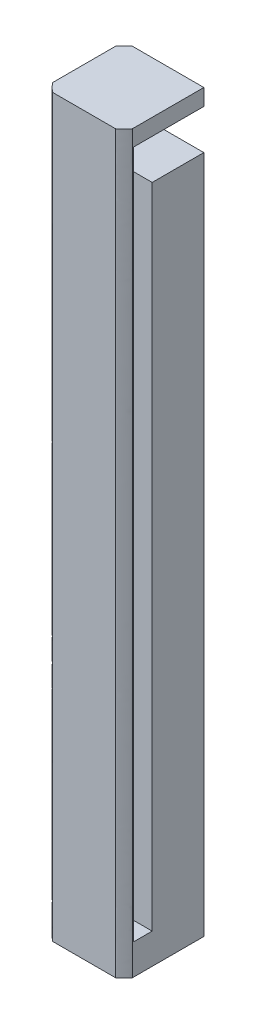
ISO-10303-21;
HEADER;
FILE_DESCRIPTION(('STEP AP214'),'2;1');
FILE_NAME('part.step','',(''),(''),'','','');
FILE_SCHEMA(('AUTOMOTIVE_DESIGN { 1 0 10303 214 1 1 1 1 }'));
ENDSEC;
DATA;
#1=APPLICATION_CONTEXT('core data for automotive mechanical design processes');
#2=APPLICATION_PROTOCOL_DEFINITION('international standard','automotive_design',2000,#1);
#3=PRODUCT_CONTEXT('',#1,'mechanical');
#4=PRODUCT('Part','Part','',(#3));
#5=PRODUCT_RELATED_PRODUCT_CATEGORY('part','',(#4));
#6=PRODUCT_DEFINITION_FORMATION('','',#4);
#7=PRODUCT_DEFINITION_CONTEXT('part definition',#1,'design');
#8=PRODUCT_DEFINITION('design','',#6,#7);
#9=PRODUCT_DEFINITION_SHAPE('','',#8);
#10=(LENGTH_UNIT() NAMED_UNIT(*) SI_UNIT(.MILLI.,.METRE.));
#11=(NAMED_UNIT(*) PLANE_ANGLE_UNIT() SI_UNIT($,.RADIAN.));
#12=(NAMED_UNIT(*) SI_UNIT($,.STERADIAN.) SOLID_ANGLE_UNIT());
#13=UNCERTAINTY_MEASURE_WITH_UNIT(LENGTH_MEASURE(1.E-05),#10,'distance_accuracy_value','');
#14=(GEOMETRIC_REPRESENTATION_CONTEXT(3) GLOBAL_UNCERTAINTY_ASSIGNED_CONTEXT((#13)) GLOBAL_UNIT_ASSIGNED_CONTEXT((#10,
#11,#12)) REPRESENTATION_CONTEXT('',''));
#15=CARTESIAN_POINT('',(0.,0.,0.));
#16=DIRECTION('',(0.,0.,1.));
#17=DIRECTION('',(1.,0.,0.));
#18=AXIS2_PLACEMENT_3D('',#15,#16,#17);
#19=CARTESIAN_POINT('',(0.,75.,-10.));
#20=DIRECTION('',(0.,0.,1.));
#21=DIRECTION('',(1.,0.,0.));
#22=AXIS2_PLACEMENT_3D('',#19,#20,#21);
#23=PLANE('',#22);
#24=DIRECTION('',(1.,0.,0.));
#25=VECTOR('',#24,1.);
#26=CARTESIAN_POINT('',(0.,-3.25,-10.));
#27=LINE('',#26,#25);
#28=CARTESIAN_POINT('',(2.4,-3.25,-10.));
#29=VERTEX_POINT('',#28);
#30=CARTESIAN_POINT('',(10.,-3.25,-10.));
#31=VERTEX_POINT('',#30);
#32=EDGE_CURVE('E253',#29,#31,#27,.T.);
#33=ORIENTED_EDGE('',*,*,#32,.F.);
#34=CARTESIAN_POINT('',(2.4,78.9125,-10.));
#35=CARTESIAN_POINT('',(2.4,50.2208333333334,-10.));
#36=CARTESIAN_POINT('',(2.4,21.5291666666666,-10.));
#37=CARTESIAN_POINT('',(2.4,-7.1625,-10.));
#38=(BOUNDED_CURVE() B_SPLINE_CURVE(3,(#34,#35,#36,#37),.UNSPECIFIED.,.F.,
.F.) B_SPLINE_CURVE_WITH_KNOTS((4,4),(-0.0039125,0.0821625),
.UNSPECIFIED.) CURVE() GEOMETRIC_REPRESENTATION_ITEM() RATIONAL_B_SPLINE_CURVE((1.,1.,1.,1.)) REPRESENTATION_ITEM(''));
#39=CARTESIAN_POINT('',(2.4,75.,-10.));
#40=VERTEX_POINT('',#39);
#41=EDGE_CURVE('E12',#29,#40,#38,.F.);
#42=ORIENTED_EDGE('',*,*,#41,.T.);
#43=DIRECTION('',(-1.,0.,0.));
#44=VECTOR('',#43,1.);
#45=CARTESIAN_POINT('',(0.,75.,-10.));
#46=LINE('',#45,#44);
#47=CARTESIAN_POINT('',(10.,75.,-10.));
#48=VERTEX_POINT('',#47);
#49=EDGE_CURVE('E483',#48,#40,#46,.T.);
#50=ORIENTED_EDGE('',*,*,#49,.F.);
#51=DIRECTION('',(0.,-1.,0.));
#52=VECTOR('',#51,1.);
#53=CARTESIAN_POINT('',(10.,75.,-10.));
#54=LINE('',#53,#52);
#55=CARTESIAN_POINT('',(10.,73.25,-10.));
#56=VERTEX_POINT('',#55);
#57=EDGE_CURVE('E482',#48,#56,#54,.T.);
#58=ORIENTED_EDGE('',*,*,#57,.T.);
#59=DIRECTION('',(1.,0.,0.));
#60=VECTOR('',#59,1.);
#61=CARTESIAN_POINT('',(2.5,73.25,-10.));
#62=LINE('',#61,#60);
#63=CARTESIAN_POINT('',(2.5,73.25,-10.));
#64=VERTEX_POINT('',#63);
#65=EDGE_CURVE('E484',#64,#56,#62,.T.);
#66=ORIENTED_EDGE('',*,*,#65,.F.);
#67=DIRECTION('',(0.,-1.,0.));
#68=VECTOR('',#67,1.);
#69=CARTESIAN_POINT('',(2.5,83.8566017177982,-10.));
#70=LINE('',#69,#68);
#71=CARTESIAN_POINT('',(2.5,0.,-10.));
#72=VERTEX_POINT('',#71);
#73=EDGE_CURVE('E819',#64,#72,#70,.T.);
#74=ORIENTED_EDGE('',*,*,#73,.T.);
#75=DIRECTION('',(1.,0.,0.));
#76=VECTOR('',#75,1.);
#77=CARTESIAN_POINT('',(0.,0.,-10.));
#78=LINE('',#77,#76);
#79=CARTESIAN_POINT('',(4.5,0.,-10.));
#80=VERTEX_POINT('',#79);
#81=EDGE_CURVE('E247',#72,#80,#78,.T.);
#82=ORIENTED_EDGE('',*,*,#81,.T.);
#83=DIRECTION('',(0.,-1.,0.));
#84=VECTOR('',#83,1.);
#85=CARTESIAN_POINT('',(4.5,83.8566017177982,-10.));
#86=LINE('',#85,#84);
#87=CARTESIAN_POINT('',(4.5,69.,-10.));
#88=VERTEX_POINT('',#87);
#89=EDGE_CURVE('E225',#88,#80,#86,.T.);
#90=ORIENTED_EDGE('',*,*,#89,.F.);
#91=DIRECTION('',(-1.,0.,0.));
#92=VECTOR('',#91,1.);
#93=CARTESIAN_POINT('',(2.5,69.,-10.));
#94=LINE('',#93,#92);
#95=CARTESIAN_POINT('',(10.,69.,-10.));
#96=VERTEX_POINT('',#95);
#97=EDGE_CURVE('E241',#96,#88,#94,.T.);
#98=ORIENTED_EDGE('',*,*,#97,.F.);
#99=DIRECTION('',(0.,1.,0.));
#100=VECTOR('',#99,1.);
#101=CARTESIAN_POINT('',(10.,-3.25,-10.));
#102=LINE('',#101,#100);
#103=EDGE_CURVE('E384',#31,#96,#102,.T.);
#104=ORIENTED_EDGE('',*,*,#103,.F.);
#105=EDGE_LOOP('',(#33,#42,#50,#58,#66,#74,#82,#90,#98,#104));
#106=FACE_BOUND('',#105,.T.);
#107=ADVANCED_FACE('F44',(#106),#23,.F.);
#108=CARTESIAN_POINT('',(0.,75.,0.));
#109=DIRECTION('',(0.,-1.,0.));
#110=DIRECTION('',(0.,0.,-1.));
#111=AXIS2_PLACEMENT_3D('',#108,#109,#110);
#112=PLANE('',#111);
#113=DIRECTION('',(-1.,0.,0.));
#114=VECTOR('',#113,1.);
#115=CARTESIAN_POINT('',(0.,75.,-1.5));
#116=LINE('',#115,#114);
#117=CARTESIAN_POINT('',(9.1,75.,-1.5));
#118=VERTEX_POINT('',#117);
#119=CARTESIAN_POINT('',(2.4,75.,-1.5));
#120=VERTEX_POINT('',#119);
#121=EDGE_CURVE('E417',#118,#120,#116,.T.);
#122=ORIENTED_EDGE('',*,*,#121,.F.);
#123=CARTESIAN_POINT('',(10.,75.,-2.4));
#124=CARTESIAN_POINT('',(10.,75.,-1.5));
#125=CARTESIAN_POINT('',(9.1,75.,-1.5));
#126=(BOUNDED_CURVE() B_SPLINE_CURVE(2,(#123,#124,#125),.UNSPECIFIED.,.F.,
.F.) B_SPLINE_CURVE_WITH_KNOTS((3,3),(0.,1.),
.UNSPECIFIED.) CURVE() GEOMETRIC_REPRESENTATION_ITEM() RATIONAL_B_SPLINE_CURVE((1.,
0.0526315789473684,1.)) REPRESENTATION_ITEM(''));
#127=CARTESIAN_POINT('',(10.,75.,-2.4));
#128=VERTEX_POINT('',#127);
#129=EDGE_CURVE('E423',#118,#128,#126,.F.);
#130=ORIENTED_EDGE('',*,*,#129,.T.);
#131=DIRECTION('',(0.,0.,-1.));
#132=VECTOR('',#131,1.);
#133=CARTESIAN_POINT('',(10.,75.,0.));
#134=LINE('',#133,#132);
#135=EDGE_CURVE('E477',#128,#48,#134,.T.);
#136=ORIENTED_EDGE('',*,*,#135,.T.);
#137=ORIENTED_EDGE('',*,*,#49,.T.);
#138=CARTESIAN_POINT('',(1.5,75.,-9.1));
#139=CARTESIAN_POINT('',(1.5,75.,-10.));
#140=CARTESIAN_POINT('',(2.4,75.,-10.));
#141=(BOUNDED_CURVE() B_SPLINE_CURVE(2,(#138,#139,#140),.UNSPECIFIED.,.F.,
.F.) B_SPLINE_CURVE_WITH_KNOTS((3,3),(0.,1.),
.UNSPECIFIED.) CURVE() GEOMETRIC_REPRESENTATION_ITEM() RATIONAL_B_SPLINE_CURVE((1.,
0.0526315789473684,1.)) REPRESENTATION_ITEM(''));
#142=CARTESIAN_POINT('',(1.5,75.,-9.1));
#143=VERTEX_POINT('',#142);
#144=EDGE_CURVE('E424',#40,#143,#141,.F.);
#145=ORIENTED_EDGE('',*,*,#144,.T.);
#146=DIRECTION('',(0.,0.,1.));
#147=VECTOR('',#146,1.);
#148=CARTESIAN_POINT('',(1.5,75.,0.));
#149=LINE('',#148,#147);
#150=CARTESIAN_POINT('',(1.5,75.,-2.4));
#151=VERTEX_POINT('',#150);
#152=EDGE_CURVE('E418',#143,#151,#149,.T.);
#153=ORIENTED_EDGE('',*,*,#152,.T.);
#154=CARTESIAN_POINT('',(2.4,75.,-1.5));
#155=CARTESIAN_POINT('',(1.5,75.,-1.5));
#156=CARTESIAN_POINT('',(1.5,75.,-2.4));
#157=(BOUNDED_CURVE() B_SPLINE_CURVE(2,(#154,#155,#156),.UNSPECIFIED.,.F.,
.F.) B_SPLINE_CURVE_WITH_KNOTS((3,3),(0.,1.),
.UNSPECIFIED.) CURVE() GEOMETRIC_REPRESENTATION_ITEM() RATIONAL_B_SPLINE_CURVE((1.,
0.0526315789473684,1.)) REPRESENTATION_ITEM(''));
#158=EDGE_CURVE('E415',#151,#120,#157,.F.);
#159=ORIENTED_EDGE('',*,*,#158,.T.);
#160=EDGE_LOOP('',(#122,#130,#136,#137,#145,#153,#159));
#161=FACE_BOUND('',#160,.T.);
#162=ADVANCED_FACE('F276',(#161),#112,.F.);
#163=CARTESIAN_POINT('',(0.,-3.25,0.));
#164=DIRECTION('',(0.,-1.,0.));
#165=DIRECTION('',(0.,0.,-1.));
#166=AXIS2_PLACEMENT_3D('',#163,#164,#165);
#167=PLANE('',#166);
#168=CARTESIAN_POINT('',(5.,-3.25,-5.));
#169=DIRECTION('',(0.,-1.,0.));
#170=DIRECTION('',(0.,0.,-1.));
#171=AXIS2_PLACEMENT_3D('',#168,#169,#170);
#172=CIRCLE('',#171,2.175);
#173=CARTESIAN_POINT('',(5.,-3.25,-7.175));
#174=VERTEX_POINT('',#173);
#175=EDGE_CURVE('E837',#174,#174,#172,.T.);
#176=ORIENTED_EDGE('',*,*,#175,.F.);
#177=EDGE_LOOP('',(#176));
#178=FACE_BOUND('',#177,.T.);
#179=DIRECTION('',(0.,0.,1.));
#180=VECTOR('',#179,1.);
#181=CARTESIAN_POINT('',(10.,-3.25,0.));
#182=LINE('',#181,#180);
#183=CARTESIAN_POINT('',(10.,-3.25,-2.4));
#184=VERTEX_POINT('',#183);
#185=EDGE_CURVE('E255',#31,#184,#182,.T.);
#186=ORIENTED_EDGE('',*,*,#185,.T.);
#187=CARTESIAN_POINT('',(9.1,-3.25,-1.5));
#188=CARTESIAN_POINT('',(10.,-3.25,-1.5));
#189=CARTESIAN_POINT('',(10.,-3.25,-2.4));
#190=(BOUNDED_CURVE() B_SPLINE_CURVE(2,(#187,#188,#189),.UNSPECIFIED.,.F.,
.F.) B_SPLINE_CURVE_WITH_KNOTS((3,3),(0.,1.),
.UNSPECIFIED.) CURVE() GEOMETRIC_REPRESENTATION_ITEM() RATIONAL_B_SPLINE_CURVE((1.,
0.0526315789473684,1.)) REPRESENTATION_ITEM(''));
#191=CARTESIAN_POINT('',(9.1,-3.25,-1.5));
#192=VERTEX_POINT('',#191);
#193=EDGE_CURVE('E295',#184,#192,#190,.F.);
#194=ORIENTED_EDGE('',*,*,#193,.T.);
#195=DIRECTION('',(-1.,0.,0.));
#196=VECTOR('',#195,1.);
#197=CARTESIAN_POINT('',(0.,-3.25,-1.5));
#198=LINE('',#197,#196);
#199=CARTESIAN_POINT('',(2.4,-3.25,-1.5));
#200=VERTEX_POINT('',#199);
#201=EDGE_CURVE('E829',#192,#200,#198,.T.);
#202=ORIENTED_EDGE('',*,*,#201,.T.);
#203=CARTESIAN_POINT('',(1.5,-3.25,-2.4));
#204=CARTESIAN_POINT('',(1.5,-3.25,-1.5));
#205=CARTESIAN_POINT('',(2.4,-3.25,-1.5));
#206=(BOUNDED_CURVE() B_SPLINE_CURVE(2,(#203,#204,#205),.UNSPECIFIED.,.F.,
.F.) B_SPLINE_CURVE_WITH_KNOTS((3,3),(0.,1.),
.UNSPECIFIED.) CURVE() GEOMETRIC_REPRESENTATION_ITEM() RATIONAL_B_SPLINE_CURVE((1.,
0.0526315789473684,1.)) REPRESENTATION_ITEM(''));
#207=CARTESIAN_POINT('',(1.5,-3.25,-2.4));
#208=VERTEX_POINT('',#207);
#209=EDGE_CURVE('E72',#200,#208,#206,.F.);
#210=ORIENTED_EDGE('',*,*,#209,.T.);
#211=DIRECTION('',(0.,0.,1.));
#212=VECTOR('',#211,1.);
#213=CARTESIAN_POINT('',(1.5,-3.25,0.));
#214=LINE('',#213,#212);
#215=CARTESIAN_POINT('',(1.5,-3.25,-9.1));
#216=VERTEX_POINT('',#215);
#217=EDGE_CURVE('E257',#216,#208,#214,.T.);
#218=ORIENTED_EDGE('',*,*,#217,.F.);
#219=CARTESIAN_POINT('',(2.4,-3.25000000000001,-10.));
#220=CARTESIAN_POINT('',(1.5,-3.25000000000001,-10.));
#221=CARTESIAN_POINT('',(1.5,-3.25000000000001,-9.1));
#222=(BOUNDED_CURVE() B_SPLINE_CURVE(2,(#219,#220,#221),.UNSPECIFIED.,.F.,
.F.) B_SPLINE_CURVE_WITH_KNOTS((3,3),(0.,1.),
.UNSPECIFIED.) CURVE() GEOMETRIC_REPRESENTATION_ITEM() RATIONAL_B_SPLINE_CURVE((1.,
0.0526315789473684,1.)) REPRESENTATION_ITEM(''));
#223=EDGE_CURVE('E65',#216,#29,#222,.F.);
#224=ORIENTED_EDGE('',*,*,#223,.T.);
#225=ORIENTED_EDGE('',*,*,#32,.T.);
#226=EDGE_LOOP('',(#186,#194,#202,#210,#218,#224,#225));
#227=FACE_BOUND('',#226,.T.);
#228=ADVANCED_FACE('F265',(#178,#227),#167,.T.);
#229=CARTESIAN_POINT('',(0.,75.,-2.5));
#230=DIRECTION('',(0.,0.,-1.));
#231=DIRECTION('',(-1.,0.,0.));
#232=AXIS2_PLACEMENT_3D('',#229,#230,#231);
#233=PLANE('',#232);
#234=DIRECTION('',(1.,0.,0.));
#235=VECTOR('',#234,1.);
#236=CARTESIAN_POINT('',(0.,0.,-2.5));
#237=LINE('',#236,#235);
#238=CARTESIAN_POINT('',(6.4,0.,-2.5));
#239=VERTEX_POINT('',#238);
#240=CARTESIAN_POINT('',(10.,0.,-2.5));
#241=VERTEX_POINT('',#240);
#242=EDGE_CURVE('E809',#239,#241,#237,.T.);
#243=ORIENTED_EDGE('',*,*,#242,.F.);
#244=DIRECTION('',(0.,-1.,0.));
#245=VECTOR('',#244,1.);
#246=CARTESIAN_POINT('',(6.4,78.7654328932551,-2.5));
#247=LINE('',#246,#245);
#248=CARTESIAN_POINT('',(6.4,73.25,-2.5));
#249=VERTEX_POINT('',#248);
#250=EDGE_CURVE('E215',#249,#239,#247,.T.);
#251=ORIENTED_EDGE('',*,*,#250,.F.);
#252=DIRECTION('',(-1.,0.,0.));
#253=VECTOR('',#252,1.);
#254=CARTESIAN_POINT('',(2.5,73.25,-2.5));
#255=LINE('',#254,#253);
#256=CARTESIAN_POINT('',(10.,73.25,-2.5));
#257=VERTEX_POINT('',#256);
#258=EDGE_CURVE('E815',#257,#249,#255,.T.);
#259=ORIENTED_EDGE('',*,*,#258,.F.);
#260=DIRECTION('',(0.,1.,0.));
#261=VECTOR('',#260,1.);
#262=CARTESIAN_POINT('',(10.,73.25,-2.5));
#263=LINE('',#262,#261);
#264=EDGE_CURVE('E812',#241,#257,#263,.T.);
#265=ORIENTED_EDGE('',*,*,#264,.F.);
#266=EDGE_LOOP('',(#243,#251,#259,#265));
#267=FACE_BOUND('',#266,.T.);
#268=ADVANCED_FACE('F275',(#267),#233,.T.);
#269=CARTESIAN_POINT('',(0.,0.,0.));
#270=DIRECTION('',(0.,-1.,0.));
#271=DIRECTION('',(0.,0.,-1.));
#272=AXIS2_PLACEMENT_3D('',#269,#270,#271);
#273=PLANE('',#272);
#274=DIRECTION('',(0.,0.,-1.));
#275=VECTOR('',#274,1.);
#276=CARTESIAN_POINT('',(6.4,0.,0.));
#277=LINE('',#276,#275);
#278=CARTESIAN_POINT('',(6.4,0.,-4.5));
#279=VERTEX_POINT('',#278);
#280=EDGE_CURVE('E217',#239,#279,#277,.T.);
#281=ORIENTED_EDGE('',*,*,#280,.F.);
#282=ORIENTED_EDGE('',*,*,#242,.T.);
#283=DIRECTION('',(0.,0.,1.));
#284=VECTOR('',#283,1.);
#285=CARTESIAN_POINT('',(10.,0.,0.));
#286=LINE('',#285,#284);
#287=CARTESIAN_POINT('',(10.,0.,-4.5));
#288=VERTEX_POINT('',#287);
#289=EDGE_CURVE('E256',#288,#241,#286,.T.);
#290=ORIENTED_EDGE('',*,*,#289,.F.);
#291=DIRECTION('',(-1.,0.,0.));
#292=VECTOR('',#291,1.);
#293=CARTESIAN_POINT('',(0.,0.,-4.5));
#294=LINE('',#293,#292);
#295=EDGE_CURVE('E226',#288,#279,#294,.T.);
#296=ORIENTED_EDGE('',*,*,#295,.T.);
#297=EDGE_LOOP('',(#281,#282,#290,#296));
#298=FACE_BOUND('',#297,.T.);
#299=ADVANCED_FACE('F636',(#298),#273,.F.);
#300=CARTESIAN_POINT('',(0.,83.8566017177982,-4.5));
#301=DIRECTION('',(0.,0.,1.));
#302=DIRECTION('',(1.,0.,0.));
#303=AXIS2_PLACEMENT_3D('',#300,#301,#302);
#304=PLANE('',#303);
#305=DIRECTION('',(-1.,0.,0.));
#306=VECTOR('',#305,1.);
#307=CARTESIAN_POINT('',(2.5,69.,-4.5));
#308=LINE('',#307,#306);
#309=CARTESIAN_POINT('',(10.,69.,-4.5));
#310=VERTEX_POINT('',#309);
#311=CARTESIAN_POINT('',(6.4,69.,-4.5));
#312=VERTEX_POINT('',#311);
#313=EDGE_CURVE('E229',#310,#312,#308,.T.);
#314=ORIENTED_EDGE('',*,*,#313,.T.);
#315=DIRECTION('',(0.,-1.,0.));
#316=VECTOR('',#315,1.);
#317=CARTESIAN_POINT('',(6.4,78.7654328932551,-4.5));
#318=LINE('',#317,#316);
#319=EDGE_CURVE('E218',#312,#279,#318,.T.);
#320=ORIENTED_EDGE('',*,*,#319,.T.);
#321=ORIENTED_EDGE('',*,*,#295,.F.);
#322=DIRECTION('',(0.,-1.,0.));
#323=VECTOR('',#322,1.);
#324=CARTESIAN_POINT('',(10.,83.8566017177982,-4.5));
#325=LINE('',#324,#323);
#326=EDGE_CURVE('E230',#310,#288,#325,.T.);
#327=ORIENTED_EDGE('',*,*,#326,.F.);
#328=EDGE_LOOP('',(#314,#320,#321,#327));
#329=FACE_BOUND('',#328,.T.);
#330=ADVANCED_FACE('F363',(#329),#304,.T.);
#331=CARTESIAN_POINT('',(10.,75.,0.));
#332=DIRECTION('',(-1.,0.,0.));
#333=DIRECTION('',(0.,0.,1.));
#334=AXIS2_PLACEMENT_3D('',#331,#332,#333);
#335=PLANE('',#334);
#336=ORIENTED_EDGE('',*,*,#135,.F.);
#337=CARTESIAN_POINT('',(10.,-7.1625,-2.4));
#338=CARTESIAN_POINT('',(10.,21.5291666666667,-2.4));
#339=CARTESIAN_POINT('',(10.,50.2208333333334,-2.4));
#340=CARTESIAN_POINT('',(10.,78.9125,-2.4));
#341=(BOUNDED_CURVE() B_SPLINE_CURVE(3,(#337,#338,#339,#340),.UNSPECIFIED.,.F.,
.F.) B_SPLINE_CURVE_WITH_KNOTS((4,4),(-0.0039125,0.0821625),
.UNSPECIFIED.) CURVE() GEOMETRIC_REPRESENTATION_ITEM() RATIONAL_B_SPLINE_CURVE((1.,1.,1.,1.)) REPRESENTATION_ITEM(''));
#342=EDGE_CURVE('E382',#128,#184,#341,.F.);
#343=ORIENTED_EDGE('',*,*,#342,.T.);
#344=ORIENTED_EDGE('',*,*,#185,.F.);
#345=ORIENTED_EDGE('',*,*,#103,.T.);
#346=DIRECTION('',(0.,0.,-1.));
#347=VECTOR('',#346,1.);
#348=CARTESIAN_POINT('',(10.,69.,8.62046982478333));
#349=LINE('',#348,#347);
#350=EDGE_CURVE('E244',#310,#96,#349,.T.);
#351=ORIENTED_EDGE('',*,*,#350,.F.);
#352=ORIENTED_EDGE('',*,*,#326,.T.);
#353=ORIENTED_EDGE('',*,*,#289,.T.);
#354=ORIENTED_EDGE('',*,*,#264,.T.);
#355=DIRECTION('',(0.,0.,-1.));
#356=VECTOR('',#355,1.);
#357=CARTESIAN_POINT('',(10.,73.25,8.62046982478333));
#358=LINE('',#357,#356);
#359=EDGE_CURVE('E867',#257,#56,#358,.T.);
#360=ORIENTED_EDGE('',*,*,#359,.T.);
#361=ORIENTED_EDGE('',*,*,#57,.F.);
#362=EDGE_LOOP('',(#336,#343,#344,#345,#351,#352,#353,#354,#360,#361));
#363=FACE_BOUND('',#362,.T.);
#364=ADVANCED_FACE('F359',(#363),#335,.F.);
#365=CARTESIAN_POINT('',(2.5,73.25,8.62046982478333));
#366=DIRECTION('',(0.,1.,0.));
#367=DIRECTION('',(0.,0.,1.));
#368=AXIS2_PLACEMENT_3D('',#365,#366,#367);
#369=PLANE('',#368);
#370=DIRECTION('',(0.,0.,-1.));
#371=VECTOR('',#370,1.);
#372=CARTESIAN_POINT('',(4.5,73.25,0.));
#373=LINE('',#372,#371);
#374=CARTESIAN_POINT('',(4.5,73.25,-4.5));
#375=VERTEX_POINT('',#374);
#376=CARTESIAN_POINT('',(4.5,73.25,-6.4));
#377=VERTEX_POINT('',#376);
#378=EDGE_CURVE('E193',#375,#377,#373,.T.);
#379=ORIENTED_EDGE('',*,*,#378,.T.);
#380=DIRECTION('',(1.,0.,0.));
#381=VECTOR('',#380,1.);
#382=CARTESIAN_POINT('',(0.,73.25,-6.4));
#383=LINE('',#382,#381);
#384=CARTESIAN_POINT('',(2.5,73.25,-6.4));
#385=VERTEX_POINT('',#384);
#386=EDGE_CURVE('E209',#385,#377,#383,.T.);
#387=ORIENTED_EDGE('',*,*,#386,.F.);
#388=DIRECTION('',(0.,0.,-1.));
#389=VECTOR('',#388,1.);
#390=CARTESIAN_POINT('',(2.5,73.25,8.62046982478333));
#391=LINE('',#390,#389);
#392=EDGE_CURVE('E817',#385,#64,#391,.T.);
#393=ORIENTED_EDGE('',*,*,#392,.T.);
#394=ORIENTED_EDGE('',*,*,#65,.T.);
#395=ORIENTED_EDGE('',*,*,#359,.F.);
#396=ORIENTED_EDGE('',*,*,#258,.T.);
#397=DIRECTION('',(0.,0.,-1.));
#398=VECTOR('',#397,1.);
#399=CARTESIAN_POINT('',(6.4,73.25,0.));
#400=LINE('',#399,#398);
#401=CARTESIAN_POINT('',(6.4,73.25,-4.5));
#402=VERTEX_POINT('',#401);
#403=EDGE_CURVE('E203',#249,#402,#400,.T.);
#404=ORIENTED_EDGE('',*,*,#403,.T.);
#405=DIRECTION('',(-1.,0.,0.));
#406=VECTOR('',#405,1.);
#407=CARTESIAN_POINT('',(0.,73.25,-4.5));
#408=LINE('',#407,#406);
#409=EDGE_CURVE('E182',#402,#375,#408,.T.);
#410=ORIENTED_EDGE('',*,*,#409,.T.);
#411=EDGE_LOOP('',(#379,#387,#393,#394,#395,#396,#404,#410));
#412=FACE_BOUND('',#411,.T.);
#413=ADVANCED_FACE('F201',(#412),#369,.F.);
#414=CARTESIAN_POINT('',(2.5,73.25,8.62046982478333));
#415=DIRECTION('',(-1.,0.,0.));
#416=DIRECTION('',(0.,-1.,0.));
#417=AXIS2_PLACEMENT_3D('',#414,#415,#416);
#418=PLANE('',#417);
#419=ORIENTED_EDGE('',*,*,#392,.F.);
#420=DIRECTION('',(0.,-1.,0.));
#421=VECTOR('',#420,1.);
#422=CARTESIAN_POINT('',(2.5,78.7654328932551,-6.4));
#423=LINE('',#422,#421);
#424=CARTESIAN_POINT('',(2.5,0.,-6.4));
#425=VERTEX_POINT('',#424);
#426=EDGE_CURVE('E212',#385,#425,#423,.T.);
#427=ORIENTED_EDGE('',*,*,#426,.T.);
#428=DIRECTION('',(0.,0.,-1.));
#429=VECTOR('',#428,1.);
#430=CARTESIAN_POINT('',(2.5,0.,0.));
#431=LINE('',#430,#429);
#432=EDGE_CURVE('E824',#425,#72,#431,.T.);
#433=ORIENTED_EDGE('',*,*,#432,.T.);
#434=ORIENTED_EDGE('',*,*,#73,.F.);
#435=EDGE_LOOP('',(#419,#427,#433,#434));
#436=FACE_BOUND('',#435,.T.);
#437=ADVANCED_FACE('F398',(#436),#418,.F.);
#438=ORIENTED_EDGE('',*,*,#432,.F.);
#439=DIRECTION('',(1.,0.,0.));
#440=VECTOR('',#439,1.);
#441=CARTESIAN_POINT('',(0.,0.,-6.4));
#442=LINE('',#441,#440);
#443=CARTESIAN_POINT('',(4.5,0.,-6.4));
#444=VERTEX_POINT('',#443);
#445=EDGE_CURVE('E189',#425,#444,#442,.T.);
#446=ORIENTED_EDGE('',*,*,#445,.T.);
#447=DIRECTION('',(0.,0.,1.));
#448=VECTOR('',#447,1.);
#449=CARTESIAN_POINT('',(4.5,0.,0.));
#450=LINE('',#449,#448);
#451=EDGE_CURVE('E222',#80,#444,#450,.T.);
#452=ORIENTED_EDGE('',*,*,#451,.F.);
#453=ORIENTED_EDGE('',*,*,#81,.F.);
#454=EDGE_LOOP('',(#438,#446,#452,#453));
#455=FACE_BOUND('',#454,.T.);
#456=ADVANCED_FACE('F280',(#455),#273,.F.);
#457=CARTESIAN_POINT('',(2.5,69.,8.62046982478333));
#458=DIRECTION('',(0.,-1.,0.));
#459=DIRECTION('',(0.,0.,-1.));
#460=AXIS2_PLACEMENT_3D('',#457,#458,#459);
#461=PLANE('',#460);
#462=ORIENTED_EDGE('',*,*,#97,.T.);
#463=DIRECTION('',(0.,0.,1.));
#464=VECTOR('',#463,1.);
#465=CARTESIAN_POINT('',(4.5,69.,8.62046982478333));
#466=LINE('',#465,#464);
#467=CARTESIAN_POINT('',(4.5,69.,-6.4));
#468=VERTEX_POINT('',#467);
#469=EDGE_CURVE('E238',#88,#468,#466,.T.);
#470=ORIENTED_EDGE('',*,*,#469,.T.);
#471=CARTESIAN_POINT('',(4.5,69.,-4.5));
#472=VERTEX_POINT('',#471);
#473=EDGE_CURVE('E237',#468,#472,#466,.T.);
#474=ORIENTED_EDGE('',*,*,#473,.T.);
#475=DIRECTION('',(-1.,0.,0.));
#476=VECTOR('',#475,1.);
#477=CARTESIAN_POINT('',(2.5,69.,-4.5));
#478=LINE('',#477,#476);
#479=EDGE_CURVE('E185',#312,#472,#478,.T.);
#480=ORIENTED_EDGE('',*,*,#479,.F.);
#481=ORIENTED_EDGE('',*,*,#313,.F.);
#482=ORIENTED_EDGE('',*,*,#350,.T.);
#483=EDGE_LOOP('',(#462,#470,#474,#480,#481,#482));
#484=FACE_BOUND('',#483,.T.);
#485=ADVANCED_FACE('F278',(#484),#461,.F.);
#486=CARTESIAN_POINT('',(4.5,83.8566017177982,0.));
#487=DIRECTION('',(1.,0.,0.));
#488=DIRECTION('',(0.,0.,-1.));
#489=AXIS2_PLACEMENT_3D('',#486,#487,#488);
#490=PLANE('',#489);
#491=ORIENTED_EDGE('',*,*,#451,.T.);
#492=DIRECTION('',(0.,1.,0.));
#493=VECTOR('',#492,1.);
#494=CARTESIAN_POINT('',(4.5,83.8566017177982,-6.4));
#495=LINE('',#494,#493);
#496=EDGE_CURVE('E436',#444,#468,#495,.T.);
#497=ORIENTED_EDGE('',*,*,#496,.T.);
#498=ORIENTED_EDGE('',*,*,#469,.F.);
#499=ORIENTED_EDGE('',*,*,#89,.T.);
#500=EDGE_LOOP('',(#491,#497,#498,#499));
#501=FACE_BOUND('',#500,.T.);
#502=ADVANCED_FACE('F616',(#501),#490,.F.);
#503=CARTESIAN_POINT('',(4.5,78.7654328932551,0.));
#504=DIRECTION('',(-1.,0.,0.));
#505=DIRECTION('',(0.,0.,1.));
#506=AXIS2_PLACEMENT_3D('',#503,#504,#505);
#507=PLANE('',#506);
#508=DIRECTION('',(0.,-1.,0.));
#509=VECTOR('',#508,1.);
#510=CARTESIAN_POINT('',(4.5,78.7654328932551,-4.5));
#511=LINE('',#510,#509);
#512=EDGE_CURVE('E177',#375,#472,#511,.T.);
#513=ORIENTED_EDGE('',*,*,#512,.T.);
#514=ORIENTED_EDGE('',*,*,#473,.F.);
#515=DIRECTION('',(0.,-1.,0.));
#516=VECTOR('',#515,1.);
#517=CARTESIAN_POINT('',(4.5,78.7654328932551,-6.4));
#518=LINE('',#517,#516);
#519=EDGE_CURVE('E195',#377,#468,#518,.T.);
#520=ORIENTED_EDGE('',*,*,#519,.F.);
#521=ORIENTED_EDGE('',*,*,#378,.F.);
#522=EDGE_LOOP('',(#513,#514,#520,#521));
#523=FACE_BOUND('',#522,.T.);
#524=ADVANCED_FACE('F194',(#523),#507,.F.);
#525=CARTESIAN_POINT('',(0.,78.7654328932551,-4.5));
#526=DIRECTION('',(0.,0.,1.));
#527=DIRECTION('',(1.,0.,0.));
#528=AXIS2_PLACEMENT_3D('',#525,#526,#527);
#529=PLANE('',#528);
#530=EDGE_CURVE('E190',#402,#312,#318,.T.);
#531=ORIENTED_EDGE('',*,*,#530,.T.);
#532=ORIENTED_EDGE('',*,*,#479,.T.);
#533=ORIENTED_EDGE('',*,*,#512,.F.);
#534=ORIENTED_EDGE('',*,*,#409,.F.);
#535=EDGE_LOOP('',(#531,#532,#533,#534));
#536=FACE_BOUND('',#535,.T.);
#537=ADVANCED_FACE('F180',(#536),#529,.F.);
#538=CARTESIAN_POINT('',(0.,78.7654328932551,-6.4));
#539=DIRECTION('',(0.,0.,-1.));
#540=DIRECTION('',(-1.,0.,0.));
#541=AXIS2_PLACEMENT_3D('',#538,#539,#540);
#542=PLANE('',#541);
#543=ORIENTED_EDGE('',*,*,#426,.F.);
#544=ORIENTED_EDGE('',*,*,#386,.T.);
#545=ORIENTED_EDGE('',*,*,#519,.T.);
#546=ORIENTED_EDGE('',*,*,#496,.F.);
#547=ORIENTED_EDGE('',*,*,#445,.F.);
#548=EDGE_LOOP('',(#543,#544,#545,#546,#547));
#549=FACE_BOUND('',#548,.T.);
#550=ADVANCED_FACE('F595',(#549),#542,.T.);
#551=CARTESIAN_POINT('',(6.4,78.7654328932551,0.));
#552=DIRECTION('',(-1.,0.,0.));
#553=DIRECTION('',(0.,0.,1.));
#554=AXIS2_PLACEMENT_3D('',#551,#552,#553);
#555=PLANE('',#554);
#556=ORIENTED_EDGE('',*,*,#403,.F.);
#557=ORIENTED_EDGE('',*,*,#250,.T.);
#558=ORIENTED_EDGE('',*,*,#280,.T.);
#559=ORIENTED_EDGE('',*,*,#319,.F.);
#560=ORIENTED_EDGE('',*,*,#530,.F.);
#561=EDGE_LOOP('',(#556,#557,#558,#559,#560));
#562=FACE_BOUND('',#561,.T.);
#563=ADVANCED_FACE('F588',(#562),#555,.F.);
#564=CARTESIAN_POINT('',(5.,-0.25,-5.));
#565=DIRECTION('',(0.,-1.,0.));
#566=DIRECTION('',(0.,0.,-1.));
#567=AXIS2_PLACEMENT_3D('',#564,#565,#566);
#568=CYLINDRICAL_SURFACE('',#567,2.175);
#569=CARTESIAN_POINT('',(5.,-0.25,-5.));
#570=DIRECTION('',(0.,-1.,0.));
#571=DIRECTION('',(0.,0.,-1.));
#572=AXIS2_PLACEMENT_3D('',#569,#570,#571);
#573=CIRCLE('',#572,2.175);
#574=CARTESIAN_POINT('',(5.,-0.25,-7.175));
#575=VERTEX_POINT('',#574);
#576=EDGE_CURVE('E210',#575,#575,#573,.T.);
#577=ORIENTED_EDGE('',*,*,#576,.F.);
#578=EDGE_LOOP('',(#577));
#579=FACE_BOUND('',#578,.T.);
#580=ORIENTED_EDGE('',*,*,#175,.T.);
#581=EDGE_LOOP('',(#580));
#582=FACE_BOUND('',#581,.T.);
#583=ADVANCED_FACE('F581',(#579,#582),#568,.F.);
#584=CARTESIAN_POINT('',(5.,-0.25,-5.));
#585=DIRECTION('',(0.,-1.,0.));
#586=DIRECTION('',(0.,0.,-1.));
#587=AXIS2_PLACEMENT_3D('',#584,#585,#586);
#588=PLANE('',#587);
#589=ORIENTED_EDGE('',*,*,#576,.T.);
#590=EDGE_LOOP('',(#589));
#591=FACE_BOUND('',#590,.T.);
#592=ADVANCED_FACE('F327',(#591),#588,.T.);
#593=CARTESIAN_POINT('',(1.5,-3.25,0.));
#594=DIRECTION('',(-1.,0.,0.));
#595=DIRECTION('',(0.,0.,1.));
#596=AXIS2_PLACEMENT_3D('',#593,#594,#595);
#597=PLANE('',#596);
#598=ORIENTED_EDGE('',*,*,#217,.T.);
#599=CARTESIAN_POINT('',(1.5,78.9125,-2.4));
#600=CARTESIAN_POINT('',(1.5,50.2208333333334,-2.4));
#601=CARTESIAN_POINT('',(1.5,21.5291666666666,-2.4));
#602=CARTESIAN_POINT('',(1.5,-7.16250000000001,-2.4));
#603=(BOUNDED_CURVE() B_SPLINE_CURVE(3,(#599,#600,#601,#602),.UNSPECIFIED.,.F.,
.F.) B_SPLINE_CURVE_WITH_KNOTS((4,4),(-0.0821625,0.0039125),
.UNSPECIFIED.) CURVE() GEOMETRIC_REPRESENTATION_ITEM() RATIONAL_B_SPLINE_CURVE((1.,1.,1.,1.)) REPRESENTATION_ITEM(''));
#604=EDGE_CURVE('E58',#208,#151,#603,.F.);
#605=ORIENTED_EDGE('',*,*,#604,.T.);
#606=ORIENTED_EDGE('',*,*,#152,.F.);
#607=CARTESIAN_POINT('',(1.5,-7.1625,-9.1));
#608=CARTESIAN_POINT('',(1.5,21.5291666666666,-9.1));
#609=CARTESIAN_POINT('',(1.5,50.2208333333334,-9.1));
#610=CARTESIAN_POINT('',(1.5,78.9125,-9.1));
#611=(BOUNDED_CURVE() B_SPLINE_CURVE(3,(#607,#608,#609,#610),.UNSPECIFIED.,.F.,
.F.) B_SPLINE_CURVE_WITH_KNOTS((4,4),(-0.0039125,0.0821625),
.UNSPECIFIED.) CURVE() GEOMETRIC_REPRESENTATION_ITEM() RATIONAL_B_SPLINE_CURVE((1.,1.,1.,1.)) REPRESENTATION_ITEM(''));
#612=EDGE_CURVE('E309',#143,#216,#611,.F.);
#613=ORIENTED_EDGE('',*,*,#612,.T.);
#614=EDGE_LOOP('',(#598,#605,#606,#613));
#615=FACE_BOUND('',#614,.T.);
#616=ADVANCED_FACE('F316',(#615),#597,.T.);
#617=CARTESIAN_POINT('',(0.,-3.25,-1.5));
#618=DIRECTION('',(0.,0.,-1.));
#619=DIRECTION('',(-1.,0.,0.));
#620=AXIS2_PLACEMENT_3D('',#617,#618,#619);
#621=PLANE('',#620);
#622=ORIENTED_EDGE('',*,*,#201,.F.);
#623=CARTESIAN_POINT('',(9.1,78.9125,-1.5));
#624=CARTESIAN_POINT('',(9.1,50.2208333333334,-1.5));
#625=CARTESIAN_POINT('',(9.1,21.5291666666667,-1.5));
#626=CARTESIAN_POINT('',(9.1,-7.1625,-1.5));
#627=(BOUNDED_CURVE() B_SPLINE_CURVE(3,(#623,#624,#625,#626),.UNSPECIFIED.,.F.,
.F.) B_SPLINE_CURVE_WITH_KNOTS((4,4),(-0.0039125,0.0821625),
.UNSPECIFIED.) CURVE() GEOMETRIC_REPRESENTATION_ITEM() RATIONAL_B_SPLINE_CURVE((1.,1.,1.,1.)) REPRESENTATION_ITEM(''));
#628=EDGE_CURVE('E430',#192,#118,#627,.F.);
#629=ORIENTED_EDGE('',*,*,#628,.T.);
#630=ORIENTED_EDGE('',*,*,#121,.T.);
#631=CARTESIAN_POINT('',(2.4,-7.16250000000001,-1.5));
#632=CARTESIAN_POINT('',(2.4,21.5291666666666,-1.5));
#633=CARTESIAN_POINT('',(2.4,50.2208333333334,-1.5));
#634=CARTESIAN_POINT('',(2.4,78.9125,-1.5));
#635=(BOUNDED_CURVE() B_SPLINE_CURVE(3,(#631,#632,#633,#634),.UNSPECIFIED.,.F.,
.F.) B_SPLINE_CURVE_WITH_KNOTS((4,4),(-0.0821625,0.0039125),
.UNSPECIFIED.) CURVE() GEOMETRIC_REPRESENTATION_ITEM() RATIONAL_B_SPLINE_CURVE((1.,1.,1.,1.)) REPRESENTATION_ITEM(''));
#636=EDGE_CURVE('E427',#120,#200,#635,.F.);
#637=ORIENTED_EDGE('',*,*,#636,.T.);
#638=EDGE_LOOP('',(#622,#629,#630,#637));
#639=FACE_BOUND('',#638,.T.);
#640=ADVANCED_FACE('F326',(#639),#621,.F.);
#641=CARTESIAN_POINT('',(9.1,-7.1625,-1.5));
#642=CARTESIAN_POINT('',(9.1,21.5291666666667,-1.5));
#643=CARTESIAN_POINT('',(9.1,50.2208333333334,-1.5));
#644=CARTESIAN_POINT('',(9.1,78.9125,-1.5));
#645=CARTESIAN_POINT('',(10.,-7.1625,-1.5));
#646=CARTESIAN_POINT('',(10.,21.5291666666667,-1.5));
#647=CARTESIAN_POINT('',(10.,50.2208333333334,-1.5));
#648=CARTESIAN_POINT('',(10.,78.9125,-1.5));
#649=CARTESIAN_POINT('',(10.,-7.1625,-2.4));
#650=CARTESIAN_POINT('',(10.,21.5291666666667,-2.4));
#651=CARTESIAN_POINT('',(10.,50.2208333333334,-2.4));
#652=CARTESIAN_POINT('',(10.,78.9125,-2.4));
#653=(BOUNDED_SURFACE() B_SPLINE_SURFACE(2,3,((#641,#642,#643,#644),(#645,#646,#647,#648),(#649,
#650,#651,#652)),.UNSPECIFIED.,.F.,.F.,.F.) B_SPLINE_SURFACE_WITH_KNOTS((3,3),(4,4),(0.,1.),
(-0.0039125,0.0821625),
.UNSPECIFIED.) GEOMETRIC_REPRESENTATION_ITEM() RATIONAL_B_SPLINE_SURFACE(((1.,1.,1.,1.),
(0.0526315789473684,0.0526315789473684,0.0526315789473684,0.0526315789473684),(1.,1.,1.,1.))) REPRESENTATION_ITEM('') SURFACE());
#654=ORIENTED_EDGE('',*,*,#193,.F.);
#655=ORIENTED_EDGE('',*,*,#342,.F.);
#656=ORIENTED_EDGE('',*,*,#129,.F.);
#657=ORIENTED_EDGE('',*,*,#628,.F.);
#658=EDGE_LOOP('',(#654,#655,#656,#657));
#659=FACE_BOUND('',#658,.T.);
#660=ADVANCED_FACE('F366',(#659),#653,.T.);
#661=CARTESIAN_POINT('',(2.4,78.9125,-1.5));
#662=CARTESIAN_POINT('',(2.4,50.2208333333334,-1.5));
#663=CARTESIAN_POINT('',(2.4,21.5291666666666,-1.5));
#664=CARTESIAN_POINT('',(2.4,-7.16250000000001,-1.5));
#665=CARTESIAN_POINT('',(1.5,78.9125,-1.5));
#666=CARTESIAN_POINT('',(1.5,50.2208333333334,-1.5));
#667=CARTESIAN_POINT('',(1.5,21.5291666666666,-1.5));
#668=CARTESIAN_POINT('',(1.5,-7.16250000000001,-1.5));
#669=CARTESIAN_POINT('',(1.5,78.9125,-2.4));
#670=CARTESIAN_POINT('',(1.5,50.2208333333334,-2.4));
#671=CARTESIAN_POINT('',(1.5,21.5291666666666,-2.4));
#672=CARTESIAN_POINT('',(1.5,-7.16250000000001,-2.4));
#673=(BOUNDED_SURFACE() B_SPLINE_SURFACE(2,3,((#661,#662,#663,#664),(#665,#666,#667,#668),(#669,
#670,#671,#672)),.UNSPECIFIED.,.F.,.F.,.F.) B_SPLINE_SURFACE_WITH_KNOTS((3,3),(4,4),(0.,1.),
(-0.0821625,0.0039125),
.UNSPECIFIED.) GEOMETRIC_REPRESENTATION_ITEM() RATIONAL_B_SPLINE_SURFACE(((1.,1.,1.,1.),
(0.0526315789473684,0.0526315789473684,0.0526315789473684,0.0526315789473684),(1.,1.,1.,1.))) REPRESENTATION_ITEM('') SURFACE());
#674=ORIENTED_EDGE('',*,*,#209,.F.);
#675=ORIENTED_EDGE('',*,*,#636,.F.);
#676=ORIENTED_EDGE('',*,*,#158,.F.);
#677=ORIENTED_EDGE('',*,*,#604,.F.);
#678=EDGE_LOOP('',(#674,#675,#676,#677));
#679=FACE_BOUND('',#678,.T.);
#680=ADVANCED_FACE('F434',(#679),#673,.T.);
#681=CARTESIAN_POINT('',(1.5,78.9125,-9.1));
#682=CARTESIAN_POINT('',(1.5,50.2208333333334,-9.1));
#683=CARTESIAN_POINT('',(1.5,21.5291666666666,-9.1));
#684=CARTESIAN_POINT('',(1.5,-7.1625,-9.1));
#685=CARTESIAN_POINT('',(1.5,78.9125,-10.));
#686=CARTESIAN_POINT('',(1.5,50.2208333333334,-10.));
#687=CARTESIAN_POINT('',(1.5,21.5291666666666,-10.));
#688=CARTESIAN_POINT('',(1.5,-7.1625,-10.));
#689=CARTESIAN_POINT('',(2.4,78.9125,-10.));
#690=CARTESIAN_POINT('',(2.4,50.2208333333334,-10.));
#691=CARTESIAN_POINT('',(2.4,21.5291666666666,-10.));
#692=CARTESIAN_POINT('',(2.4,-7.1625,-10.));
#693=(BOUNDED_SURFACE() B_SPLINE_SURFACE(2,3,((#681,#682,#683,#684),(#685,#686,#687,#688),(#689,
#690,#691,#692)),.UNSPECIFIED.,.F.,.F.,.F.) B_SPLINE_SURFACE_WITH_KNOTS((3,3),(4,4),(0.,1.),
(-0.0039125,0.0821625),
.UNSPECIFIED.) GEOMETRIC_REPRESENTATION_ITEM() RATIONAL_B_SPLINE_SURFACE(((1.,1.,1.,1.),
(0.0526315789473684,0.0526315789473684,0.0526315789473684,0.0526315789473684),(1.,1.,1.,1.))) REPRESENTATION_ITEM('') SURFACE());
#694=ORIENTED_EDGE('',*,*,#223,.F.);
#695=ORIENTED_EDGE('',*,*,#612,.F.);
#696=ORIENTED_EDGE('',*,*,#144,.F.);
#697=ORIENTED_EDGE('',*,*,#41,.F.);
#698=EDGE_LOOP('',(#694,#695,#696,#697));
#699=FACE_BOUND('',#698,.T.);
#700=ADVANCED_FACE('F47',(#699),#693,.T.);
#701=CLOSED_SHELL('',(#107,#162,#228,#268,#299,#330,#364,#413,#437,#456,#485,#502,#524,#537,
#550,#563,#583,#592,#616,#640,#660,#680,#700));
#702=MANIFOLD_SOLID_BREP('B2',#701);
#703=ADVANCED_BREP_SHAPE_REPRESENTATION('',(#18,#702),#14);
#704=SHAPE_DEFINITION_REPRESENTATION(#9,#703);
ENDSEC;
END-ISO-10303-21;
